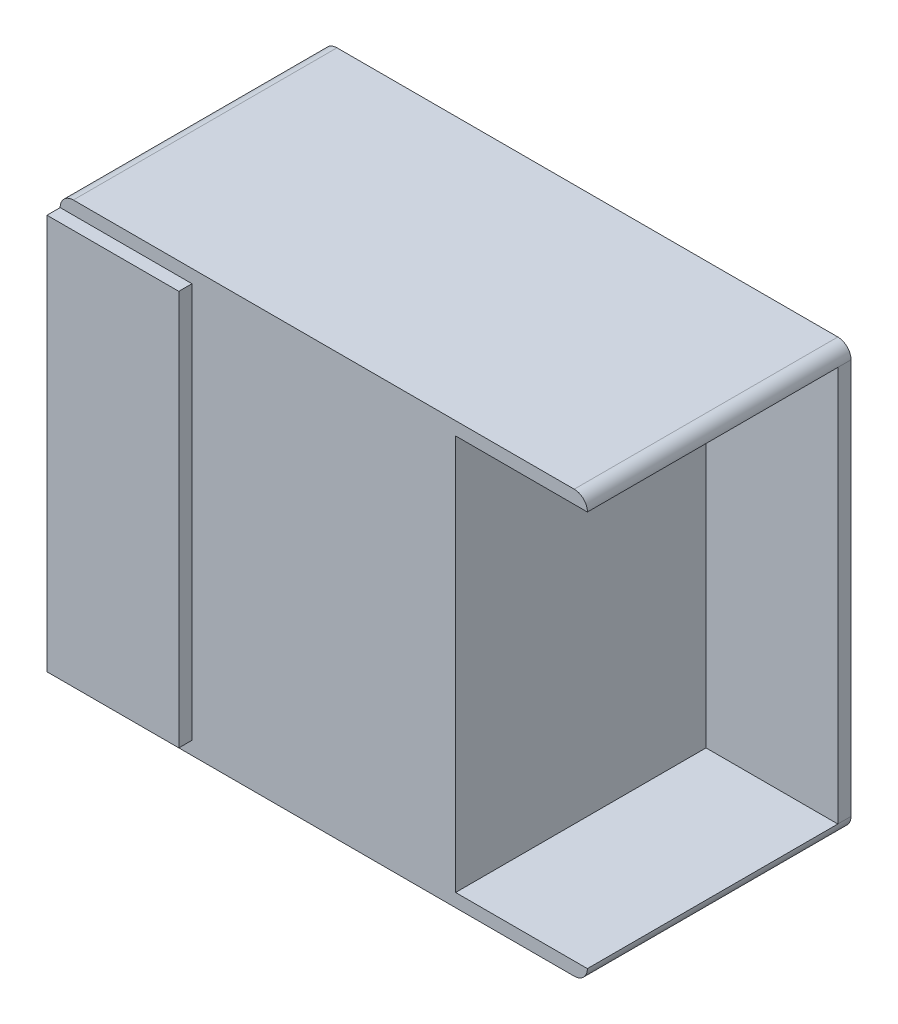
ISO-10303-21;
HEADER;
FILE_DESCRIPTION(('STEP AP214'),'2;1');
FILE_NAME('part.step','',(''),(''),'','','');
FILE_SCHEMA(('AUTOMOTIVE_DESIGN { 1 0 10303 214 1 1 1 1 }'));
ENDSEC;
DATA;
#1=APPLICATION_CONTEXT('core data for automotive mechanical design processes');
#2=APPLICATION_PROTOCOL_DEFINITION('international standard','automotive_design',2000,#1);
#3=PRODUCT_CONTEXT('',#1,'mechanical');
#4=PRODUCT('Part','Part','',(#3));
#5=PRODUCT_RELATED_PRODUCT_CATEGORY('part','',(#4));
#6=PRODUCT_DEFINITION_FORMATION('','',#4);
#7=PRODUCT_DEFINITION_CONTEXT('part definition',#1,'design');
#8=PRODUCT_DEFINITION('design','',#6,#7);
#9=PRODUCT_DEFINITION_SHAPE('','',#8);
#10=(LENGTH_UNIT() NAMED_UNIT(*) SI_UNIT(.MILLI.,.METRE.));
#11=(NAMED_UNIT(*) PLANE_ANGLE_UNIT() SI_UNIT($,.RADIAN.));
#12=(NAMED_UNIT(*) SI_UNIT($,.STERADIAN.) SOLID_ANGLE_UNIT());
#13=UNCERTAINTY_MEASURE_WITH_UNIT(LENGTH_MEASURE(1.E-05),#10,'distance_accuracy_value','');
#14=(GEOMETRIC_REPRESENTATION_CONTEXT(3) GLOBAL_UNCERTAINTY_ASSIGNED_CONTEXT((#13)) GLOBAL_UNIT_ASSIGNED_CONTEXT((#10,
#11,#12)) REPRESENTATION_CONTEXT('',''));
#15=CARTESIAN_POINT('',(0.,0.,0.));
#16=DIRECTION('',(0.,0.,1.));
#17=DIRECTION('',(1.,0.,0.));
#18=AXIS2_PLACEMENT_3D('',#15,#16,#17);
#19=CARTESIAN_POINT('',(15.79883231529,32.75,-0.527911551087));
#20=DIRECTION('',(-1.,0.,0.));
#21=DIRECTION('',(0.,1.,0.));
#22=AXIS2_PLACEMENT_3D('',#19,#20,#21);
#23=PLANE('',#22);
#24=DIRECTION('',(0.,0.,1.));
#25=VECTOR('',#24,1.);
#26=CARTESIAN_POINT('',(15.79883231529,33.5,-0.527911551087));
#27=LINE('',#26,#25);
#28=CARTESIAN_POINT('',(15.79883231529,33.5,-0.05291155108678));
#29=VERTEX_POINT('',#28);
#30=CARTESIAN_POINT('',(15.79883231529,33.5,-0.00291155108678));
#31=VERTEX_POINT('',#30);
#32=EDGE_CURVE('E103',#29,#31,#27,.T.);
#33=ORIENTED_EDGE('',*,*,#32,.T.);
#34=DIRECTION('',(0.,-1.,0.));
#35=VECTOR('',#34,1.);
#36=CARTESIAN_POINT('',(15.79883231529,32.75,-0.00291155108678));
#37=LINE('',#36,#35);
#38=CARTESIAN_POINT('',(15.79883231529,32.,-0.00291155108678));
#39=VERTEX_POINT('',#38);
#40=EDGE_CURVE('E266',#31,#39,#37,.T.);
#41=ORIENTED_EDGE('',*,*,#40,.T.);
#42=DIRECTION('',(0.,0.,-1.));
#43=VECTOR('',#42,1.);
#44=CARTESIAN_POINT('',(15.79883231529,32.,-0.527911551087));
#45=LINE('',#44,#43);
#46=CARTESIAN_POINT('',(15.79883231529,32.,-0.05291155108678));
#47=VERTEX_POINT('',#46);
#48=EDGE_CURVE('E92',#39,#47,#45,.T.);
#49=ORIENTED_EDGE('',*,*,#48,.T.);
#50=DIRECTION('',(0.,1.,0.));
#51=VECTOR('',#50,1.);
#52=CARTESIAN_POINT('',(15.79883231529,32.75,-0.05291155108678));
#53=LINE('',#52,#51);
#54=EDGE_CURVE('E253',#47,#29,#53,.T.);
#55=ORIENTED_EDGE('',*,*,#54,.T.);
#56=EDGE_LOOP('',(#33,#41,#49,#55));
#57=FACE_BOUND('',#56,.T.);
#58=ADVANCED_FACE('F17',(#57),#23,.F.);
#59=CARTESIAN_POINT('',(16.79883231529,32.75,-0.527911551087));
#60=DIRECTION('',(1.,0.,0.));
#61=DIRECTION('',(0.,1.,0.));
#62=AXIS2_PLACEMENT_3D('',#59,#60,#61);
#63=PLANE('',#62);
#64=DIRECTION('',(0.,-1.,0.));
#65=VECTOR('',#64,1.);
#66=CARTESIAN_POINT('',(16.79883231529,32.75,-0.05291155108678));
#67=LINE('',#66,#65);
#68=CARTESIAN_POINT('',(16.79883231529,33.5,-0.05291155108678));
#69=VERTEX_POINT('',#68);
#70=CARTESIAN_POINT('',(16.79883231529,32.,-0.05291155108678));
#71=VERTEX_POINT('',#70);
#72=EDGE_CURVE('E261',#69,#71,#67,.T.);
#73=ORIENTED_EDGE('',*,*,#72,.T.);
#74=DIRECTION('',(0.,0.,1.));
#75=VECTOR('',#74,1.);
#76=CARTESIAN_POINT('',(16.79883231529,32.,-0.527911551087));
#77=LINE('',#76,#75);
#78=CARTESIAN_POINT('',(16.79883231529,32.,-1.002911551087));
#79=VERTEX_POINT('',#78);
#80=EDGE_CURVE('E28',#79,#71,#77,.T.);
#81=ORIENTED_EDGE('',*,*,#80,.F.);
#82=DIRECTION('',(0.,1.,0.));
#83=VECTOR('',#82,1.);
#84=CARTESIAN_POINT('',(16.79883231529,32.75,-1.002911551087));
#85=LINE('',#84,#83);
#86=CARTESIAN_POINT('',(16.79883231529,33.5,-1.002911551087));
#87=VERTEX_POINT('',#86);
#88=EDGE_CURVE('E11',#79,#87,#85,.T.);
#89=ORIENTED_EDGE('',*,*,#88,.T.);
#90=DIRECTION('',(0.,0.,-1.));
#91=VECTOR('',#90,1.);
#92=CARTESIAN_POINT('',(16.79883231529,33.5,-0.527911551087));
#93=LINE('',#92,#91);
#94=EDGE_CURVE('E238',#69,#87,#93,.T.);
#95=ORIENTED_EDGE('',*,*,#94,.F.);
#96=EDGE_LOOP('',(#73,#81,#89,#95));
#97=FACE_BOUND('',#96,.T.);
#98=ADVANCED_FACE('F412',(#97),#63,.T.);
#99=CARTESIAN_POINT('',(17.02383231529,32.75,-1.002911551087));
#100=DIRECTION('',(0.,0.,-1.));
#101=DIRECTION('',(-1.,0.,0.));
#102=AXIS2_PLACEMENT_3D('',#99,#100,#101);
#103=PLANE('',#102);
#104=DIRECTION('',(-1.,0.,0.));
#105=VECTOR('',#104,1.);
#106=CARTESIAN_POINT('',(17.02383231529,32.,-1.002911551087));
#107=LINE('',#106,#105);
#108=CARTESIAN_POINT('',(17.29883231529,32.,-1.002911551087));
#109=VERTEX_POINT('',#108);
#110=EDGE_CURVE('E302',#109,#79,#107,.T.);
#111=ORIENTED_EDGE('',*,*,#110,.F.);
#112=DIRECTION('',(0.,1.,0.));
#113=VECTOR('',#112,1.);
#114=CARTESIAN_POINT('',(17.29883231529,32.75,-1.002911551087));
#115=LINE('',#114,#113);
#116=CARTESIAN_POINT('',(17.29883231529,33.5,-1.002911551087));
#117=VERTEX_POINT('',#116);
#118=EDGE_CURVE('E223',#109,#117,#115,.T.);
#119=ORIENTED_EDGE('',*,*,#118,.T.);
#120=DIRECTION('',(1.,0.,0.));
#121=VECTOR('',#120,1.);
#122=CARTESIAN_POINT('',(17.02383231529,33.5,-1.002911551087));
#123=LINE('',#122,#121);
#124=EDGE_CURVE('E259',#87,#117,#123,.T.);
#125=ORIENTED_EDGE('',*,*,#124,.F.);
#126=ORIENTED_EDGE('',*,*,#88,.F.);
#127=EDGE_LOOP('',(#111,#119,#125,#126));
#128=FACE_BOUND('',#127,.T.);
#129=ADVANCED_FACE('F410',(#128),#103,.F.);
#130=CARTESIAN_POINT('',(17.02383231529,32.,-0.527911551087));
#131=DIRECTION('',(0.,1.,0.));
#132=DIRECTION('',(1.,0.,0.));
#133=AXIS2_PLACEMENT_3D('',#130,#131,#132);
#134=PLANE('',#133);
#135=DIRECTION('',(1.,0.,0.));
#136=VECTOR('',#135,1.);
#137=CARTESIAN_POINT('',(16.29883231529,32.,-0.05291155108678));
#138=LINE('',#137,#136);
#139=CARTESIAN_POINT('',(17.29883231529,32.,-0.05291155108678));
#140=VERTEX_POINT('',#139);
#141=EDGE_CURVE('E232',#71,#140,#138,.T.);
#142=ORIENTED_EDGE('',*,*,#141,.T.);
#143=DIRECTION('',(0.,0.,1.));
#144=VECTOR('',#143,1.);
#145=CARTESIAN_POINT('',(17.29883231529,32.,-0.552911551087));
#146=LINE('',#145,#144);
#147=EDGE_CURVE('E224',#109,#140,#146,.T.);
#148=ORIENTED_EDGE('',*,*,#147,.F.);
#149=ORIENTED_EDGE('',*,*,#110,.T.);
#150=ORIENTED_EDGE('',*,*,#80,.T.);
#151=EDGE_LOOP('',(#142,#148,#149,#150));
#152=FACE_BOUND('',#151,.T.);
#153=ADVANCED_FACE('F395',(#152),#134,.T.);
#154=CARTESIAN_POINT('',(15.57383231529,33.5,-0.527911551087));
#155=DIRECTION('',(0.,-1.,0.));
#156=DIRECTION('',(0.,0.,-1.));
#157=AXIS2_PLACEMENT_3D('',#154,#155,#156);
#158=PLANE('',#157);
#159=DIRECTION('',(0.,0.,1.));
#160=VECTOR('',#159,1.);
#161=CARTESIAN_POINT('',(15.29883231529,33.5,-0.527911551087));
#162=LINE('',#161,#160);
#163=CARTESIAN_POINT('',(15.29883231529,33.5,-0.05291155108678));
#164=VERTEX_POINT('',#163);
#165=CARTESIAN_POINT('',(15.29883231529,33.5,-0.00291155108678));
#166=VERTEX_POINT('',#165);
#167=EDGE_CURVE('E294',#164,#166,#162,.T.);
#168=ORIENTED_EDGE('',*,*,#167,.T.);
#169=DIRECTION('',(1.,0.,0.));
#170=VECTOR('',#169,1.);
#171=CARTESIAN_POINT('',(15.57383231529,33.5,-0.00291155108678));
#172=LINE('',#171,#170);
#173=EDGE_CURVE('E303',#166,#31,#172,.T.);
#174=ORIENTED_EDGE('',*,*,#173,.T.);
#175=ORIENTED_EDGE('',*,*,#32,.F.);
#176=DIRECTION('',(-1.,0.,0.));
#177=VECTOR('',#176,1.);
#178=CARTESIAN_POINT('',(16.29883231529,33.5,-0.05291155108678));
#179=LINE('',#178,#177);
#180=EDGE_CURVE('E127',#29,#164,#179,.T.);
#181=ORIENTED_EDGE('',*,*,#180,.T.);
#182=EDGE_LOOP('',(#168,#174,#175,#181));
#183=FACE_BOUND('',#182,.T.);
#184=ADVANCED_FACE('F314',(#183),#158,.F.);
#185=CARTESIAN_POINT('',(15.57383231529,32.75,-0.00291155108678));
#186=DIRECTION('',(0.,0.,-1.));
#187=DIRECTION('',(-1.,0.,0.));
#188=AXIS2_PLACEMENT_3D('',#185,#186,#187);
#189=PLANE('',#188);
#190=DIRECTION('',(0.,-1.,0.));
#191=VECTOR('',#190,1.);
#192=CARTESIAN_POINT('',(15.29883231529,32.75,-0.00291155108678));
#193=LINE('',#192,#191);
#194=CARTESIAN_POINT('',(15.29883231529,32.,-0.00291155108678));
#195=VERTEX_POINT('',#194);
#196=EDGE_CURVE('E291',#166,#195,#193,.T.);
#197=ORIENTED_EDGE('',*,*,#196,.T.);
#198=DIRECTION('',(1.,0.,0.));
#199=VECTOR('',#198,1.);
#200=CARTESIAN_POINT('',(15.57383231529,32.,-0.00291155108678));
#201=LINE('',#200,#199);
#202=EDGE_CURVE('E247',#195,#39,#201,.T.);
#203=ORIENTED_EDGE('',*,*,#202,.T.);
#204=ORIENTED_EDGE('',*,*,#40,.F.);
#205=ORIENTED_EDGE('',*,*,#173,.F.);
#206=EDGE_LOOP('',(#197,#203,#204,#205));
#207=FACE_BOUND('',#206,.T.);
#208=ADVANCED_FACE('F317',(#207),#189,.F.);
#209=CARTESIAN_POINT('',(15.57383231529,32.,-0.527911551087));
#210=DIRECTION('',(0.,1.,0.));
#211=DIRECTION('',(1.,0.,0.));
#212=AXIS2_PLACEMENT_3D('',#209,#210,#211);
#213=PLANE('',#212);
#214=ORIENTED_EDGE('',*,*,#48,.F.);
#215=ORIENTED_EDGE('',*,*,#202,.F.);
#216=DIRECTION('',(0.,0.,-1.));
#217=VECTOR('',#216,1.);
#218=CARTESIAN_POINT('',(15.29883231529,32.,-0.527911551087));
#219=LINE('',#218,#217);
#220=CARTESIAN_POINT('',(15.29883231529,32.,-0.05291155108678));
#221=VERTEX_POINT('',#220);
#222=EDGE_CURVE('E176',#195,#221,#219,.T.);
#223=ORIENTED_EDGE('',*,*,#222,.T.);
#224=DIRECTION('',(1.,0.,0.));
#225=VECTOR('',#224,1.);
#226=CARTESIAN_POINT('',(16.29883231529,32.,-0.05291155108678));
#227=LINE('',#226,#225);
#228=EDGE_CURVE('E21',#221,#47,#227,.T.);
#229=ORIENTED_EDGE('',*,*,#228,.T.);
#230=EDGE_LOOP('',(#214,#215,#223,#229));
#231=FACE_BOUND('',#230,.T.);
#232=ADVANCED_FACE('F432',(#231),#213,.F.);
#233=CARTESIAN_POINT('',(16.29883231529,32.75,-0.05291155108678));
#234=DIRECTION('',(0.,0.,-1.));
#235=DIRECTION('',(-1.,0.,0.));
#236=AXIS2_PLACEMENT_3D('',#233,#234,#235);
#237=PLANE('',#236);
#238=ORIENTED_EDGE('',*,*,#72,.F.);
#239=DIRECTION('',(-1.,0.,0.));
#240=VECTOR('',#239,1.);
#241=CARTESIAN_POINT('',(17.02383231529,33.5,-0.05291155108678));
#242=LINE('',#241,#240);
#243=CARTESIAN_POINT('',(17.29883231529,33.5,-0.05291155108678));
#244=VERTEX_POINT('',#243);
#245=EDGE_CURVE('E231',#244,#69,#242,.T.);
#246=ORIENTED_EDGE('',*,*,#245,.F.);
#247=CARTESIAN_POINT('',(17.24883231529,33.5,-0.05291155108678));
#248=DIRECTION('',(0.,0.,-1.));
#249=DIRECTION('',(-1.,0.,0.));
#250=AXIS2_PLACEMENT_3D('',#247,#248,#249);
#251=CIRCLE('',#250,0.05);
#252=CARTESIAN_POINT('',(17.24883231529,33.55,-0.05291155108678));
#253=VERTEX_POINT('',#252);
#254=EDGE_CURVE('E227',#253,#244,#251,.T.);
#255=ORIENTED_EDGE('',*,*,#254,.F.);
#256=DIRECTION('',(-1.,0.,0.));
#257=VECTOR('',#256,1.);
#258=CARTESIAN_POINT('',(16.29883231529,33.55,-0.05291155108678));
#259=LINE('',#258,#257);
#260=CARTESIAN_POINT('',(15.34883231529,33.55,-0.05291155108678));
#261=VERTEX_POINT('',#260);
#262=EDGE_CURVE('E273',#253,#261,#259,.T.);
#263=ORIENTED_EDGE('',*,*,#262,.T.);
#264=CARTESIAN_POINT('',(15.34883231529,33.5,-0.05291155108678));
#265=DIRECTION('',(0.,0.,-1.));
#266=DIRECTION('',(-1.,0.,0.));
#267=AXIS2_PLACEMENT_3D('',#264,#265,#266);
#268=CIRCLE('',#267,0.05);
#269=EDGE_CURVE('E142',#164,#261,#268,.T.);
#270=ORIENTED_EDGE('',*,*,#269,.F.);
#271=ORIENTED_EDGE('',*,*,#180,.F.);
#272=ORIENTED_EDGE('',*,*,#54,.F.);
#273=ORIENTED_EDGE('',*,*,#228,.F.);
#274=CARTESIAN_POINT('',(15.34883231529,32.,-0.05291155108678));
#275=DIRECTION('',(0.,0.,-1.));
#276=DIRECTION('',(-1.,0.,0.));
#277=AXIS2_PLACEMENT_3D('',#274,#275,#276);
#278=CIRCLE('',#277,0.05);
#279=CARTESIAN_POINT('',(15.34883231529,31.95,-0.05291155108678));
#280=VERTEX_POINT('',#279);
#281=EDGE_CURVE('E171',#280,#221,#278,.T.);
#282=ORIENTED_EDGE('',*,*,#281,.F.);
#283=DIRECTION('',(1.,0.,0.));
#284=VECTOR('',#283,1.);
#285=CARTESIAN_POINT('',(16.29883231529,31.95,-0.05291155108678));
#286=LINE('',#285,#284);
#287=CARTESIAN_POINT('',(17.24883231529,31.95,-0.05291155108678));
#288=VERTEX_POINT('',#287);
#289=EDGE_CURVE('E213',#280,#288,#286,.T.);
#290=ORIENTED_EDGE('',*,*,#289,.T.);
#291=CARTESIAN_POINT('',(17.24883231529,32.,-0.05291155108678));
#292=DIRECTION('',(0.,0.,-1.));
#293=DIRECTION('',(-1.,0.,0.));
#294=AXIS2_PLACEMENT_3D('',#291,#292,#293);
#295=CIRCLE('',#294,0.05);
#296=EDGE_CURVE('E219',#140,#288,#295,.T.);
#297=ORIENTED_EDGE('',*,*,#296,.F.);
#298=ORIENTED_EDGE('',*,*,#141,.F.);
#299=EDGE_LOOP('',(#238,#246,#255,#263,#270,#271,#272,#273,#282,#290,#297,#298));
#300=FACE_BOUND('',#299,.T.);
#301=ADVANCED_FACE('F321',(#300),#237,.F.);
#302=CARTESIAN_POINT('',(17.02383231529,33.5,-0.527911551087));
#303=DIRECTION('',(0.,-1.,0.));
#304=DIRECTION('',(0.,0.,-1.));
#305=AXIS2_PLACEMENT_3D('',#302,#303,#304);
#306=PLANE('',#305);
#307=ORIENTED_EDGE('',*,*,#245,.T.);
#308=ORIENTED_EDGE('',*,*,#94,.T.);
#309=ORIENTED_EDGE('',*,*,#124,.T.);
#310=DIRECTION('',(0.,0.,-1.));
#311=VECTOR('',#310,1.);
#312=CARTESIAN_POINT('',(17.29883231529,33.5,-0.552911551087));
#313=LINE('',#312,#311);
#314=EDGE_CURVE('E251',#244,#117,#313,.T.);
#315=ORIENTED_EDGE('',*,*,#314,.F.);
#316=EDGE_LOOP('',(#307,#308,#309,#315));
#317=FACE_BOUND('',#316,.T.);
#318=ADVANCED_FACE('F409',(#317),#306,.T.);
#319=CARTESIAN_POINT('',(17.29883231529,32.75,-0.552911551087));
#320=DIRECTION('',(-1.,0.,0.));
#321=DIRECTION('',(0.,1.,0.));
#322=AXIS2_PLACEMENT_3D('',#319,#320,#321);
#323=PLANE('',#322);
#324=DIRECTION('',(0.,0.,-1.));
#325=VECTOR('',#324,1.);
#326=CARTESIAN_POINT('',(17.29883231529,33.5,-0.552911551087));
#327=LINE('',#326,#325);
#328=CARTESIAN_POINT('',(17.29883231529,33.5,-1.052911551087));
#329=VERTEX_POINT('',#328);
#330=EDGE_CURVE('E248',#117,#329,#327,.T.);
#331=ORIENTED_EDGE('',*,*,#330,.F.);
#332=ORIENTED_EDGE('',*,*,#118,.F.);
#333=DIRECTION('',(0.,0.,1.));
#334=VECTOR('',#333,1.);
#335=CARTESIAN_POINT('',(17.29883231529,32.,-0.552911551087));
#336=LINE('',#335,#334);
#337=CARTESIAN_POINT('',(17.29883231529,32.,-1.052911551087));
#338=VERTEX_POINT('',#337);
#339=EDGE_CURVE('E217',#338,#109,#336,.T.);
#340=ORIENTED_EDGE('',*,*,#339,.F.);
#341=DIRECTION('',(0.,-1.,0.));
#342=VECTOR('',#341,1.);
#343=CARTESIAN_POINT('',(17.29883231529,32.75,-1.052911551087));
#344=LINE('',#343,#342);
#345=EDGE_CURVE('E205',#329,#338,#344,.T.);
#346=ORIENTED_EDGE('',*,*,#345,.F.);
#347=EDGE_LOOP('',(#331,#332,#340,#346));
#348=FACE_BOUND('',#347,.T.);
#349=ADVANCED_FACE('F352',(#348),#323,.F.);
#350=CARTESIAN_POINT('',(17.24883231529,32.,-0.552911551087));
#351=DIRECTION('',(0.,0.,-1.));
#352=DIRECTION('',(-1.,0.,0.));
#353=AXIS2_PLACEMENT_3D('',#350,#351,#352);
#354=CYLINDRICAL_SURFACE('',#353,0.05);
#355=CARTESIAN_POINT('',(17.24883231529,32.,-1.052911551087));
#356=DIRECTION('',(0.,0.,-1.));
#357=DIRECTION('',(-1.,0.,0.));
#358=AXIS2_PLACEMENT_3D('',#355,#356,#357);
#359=CIRCLE('',#358,0.05);
#360=CARTESIAN_POINT('',(17.24883231529,31.95,-1.052911551087));
#361=VERTEX_POINT('',#360);
#362=EDGE_CURVE('E199',#338,#361,#359,.T.);
#363=ORIENTED_EDGE('',*,*,#362,.F.);
#364=ORIENTED_EDGE('',*,*,#339,.T.);
#365=ORIENTED_EDGE('',*,*,#147,.T.);
#366=ORIENTED_EDGE('',*,*,#296,.T.);
#367=DIRECTION('',(0.,0.,-1.));
#368=VECTOR('',#367,1.);
#369=CARTESIAN_POINT('',(17.24883231529,31.95,-0.552911551087));
#370=LINE('',#369,#368);
#371=EDGE_CURVE('E218',#288,#361,#370,.T.);
#372=ORIENTED_EDGE('',*,*,#371,.T.);
#373=EDGE_LOOP('',(#363,#364,#365,#366,#372));
#374=FACE_BOUND('',#373,.T.);
#375=ADVANCED_FACE('F346',(#374),#354,.T.);
#376=CARTESIAN_POINT('',(16.29883231529,31.95,-0.552911551087));
#377=DIRECTION('',(0.,1.,0.));
#378=DIRECTION('',(1.,0.,0.));
#379=AXIS2_PLACEMENT_3D('',#376,#377,#378);
#380=PLANE('',#379);
#381=DIRECTION('',(0.,0.,1.));
#382=VECTOR('',#381,1.);
#383=CARTESIAN_POINT('',(15.34883231529,31.95,-0.552911551087));
#384=LINE('',#383,#382);
#385=CARTESIAN_POINT('',(15.34883231529,31.95,-1.052911551087));
#386=VERTEX_POINT('',#385);
#387=EDGE_CURVE('E269',#386,#280,#384,.T.);
#388=ORIENTED_EDGE('',*,*,#387,.F.);
#389=DIRECTION('',(-1.,0.,0.));
#390=VECTOR('',#389,1.);
#391=CARTESIAN_POINT('',(16.29883231529,31.95,-1.052911551087));
#392=LINE('',#391,#390);
#393=EDGE_CURVE('E192',#361,#386,#392,.T.);
#394=ORIENTED_EDGE('',*,*,#393,.F.);
#395=ORIENTED_EDGE('',*,*,#371,.F.);
#396=ORIENTED_EDGE('',*,*,#289,.F.);
#397=EDGE_LOOP('',(#388,#394,#395,#396));
#398=FACE_BOUND('',#397,.T.);
#399=ADVANCED_FACE('F19',(#398),#380,.F.);
#400=CARTESIAN_POINT('',(15.34883231529,32.,-0.552911551087));
#401=DIRECTION('',(0.,0.,-1.));
#402=DIRECTION('',(-1.,0.,0.));
#403=AXIS2_PLACEMENT_3D('',#400,#401,#402);
#404=CYLINDRICAL_SURFACE('',#403,0.05);
#405=ORIENTED_EDGE('',*,*,#387,.T.);
#406=ORIENTED_EDGE('',*,*,#281,.T.);
#407=DIRECTION('',(0.,0.,-1.));
#408=VECTOR('',#407,1.);
#409=CARTESIAN_POINT('',(15.29883231529,32.,-0.527911551087));
#410=LINE('',#409,#408);
#411=CARTESIAN_POINT('',(15.29883231529,32.,-1.052911551087));
#412=VERTEX_POINT('',#411);
#413=EDGE_CURVE('E163',#221,#412,#410,.T.);
#414=ORIENTED_EDGE('',*,*,#413,.T.);
#415=CARTESIAN_POINT('',(15.34883231529,32.,-1.052911551087));
#416=DIRECTION('',(0.,0.,-1.));
#417=DIRECTION('',(-1.,0.,0.));
#418=AXIS2_PLACEMENT_3D('',#415,#416,#417);
#419=CIRCLE('',#418,0.05);
#420=EDGE_CURVE('E168',#386,#412,#419,.T.);
#421=ORIENTED_EDGE('',*,*,#420,.F.);
#422=EDGE_LOOP('',(#405,#406,#414,#421));
#423=FACE_BOUND('',#422,.T.);
#424=ADVANCED_FACE('F166',(#423),#404,.T.);
#425=CARTESIAN_POINT('',(15.29883231529,32.75,-0.527911551087));
#426=DIRECTION('',(1.,0.,0.));
#427=DIRECTION('',(0.,1.,0.));
#428=AXIS2_PLACEMENT_3D('',#425,#426,#427);
#429=PLANE('',#428);
#430=DIRECTION('',(0.,1.,0.));
#431=VECTOR('',#430,1.);
#432=CARTESIAN_POINT('',(15.29883231529,32.75,-1.052911551087));
#433=LINE('',#432,#431);
#434=CARTESIAN_POINT('',(15.29883231529,33.5,-1.052911551087));
#435=VERTEX_POINT('',#434);
#436=EDGE_CURVE('E179',#412,#435,#433,.T.);
#437=ORIENTED_EDGE('',*,*,#436,.F.);
#438=ORIENTED_EDGE('',*,*,#413,.F.);
#439=ORIENTED_EDGE('',*,*,#222,.F.);
#440=ORIENTED_EDGE('',*,*,#196,.F.);
#441=ORIENTED_EDGE('',*,*,#167,.F.);
#442=DIRECTION('',(0.,0.,1.));
#443=VECTOR('',#442,1.);
#444=CARTESIAN_POINT('',(15.29883231529,33.5,-0.552911551087));
#445=LINE('',#444,#443);
#446=EDGE_CURVE('E181',#435,#164,#445,.T.);
#447=ORIENTED_EDGE('',*,*,#446,.F.);
#448=EDGE_LOOP('',(#437,#438,#439,#440,#441,#447));
#449=FACE_BOUND('',#448,.T.);
#450=ADVANCED_FACE('F180',(#449),#429,.F.);
#451=CARTESIAN_POINT('',(15.34883231529,33.5,-0.552911551087));
#452=DIRECTION('',(0.,0.,-1.));
#453=DIRECTION('',(-1.,0.,0.));
#454=AXIS2_PLACEMENT_3D('',#451,#452,#453);
#455=CYLINDRICAL_SURFACE('',#454,0.05);
#456=ORIENTED_EDGE('',*,*,#446,.T.);
#457=ORIENTED_EDGE('',*,*,#269,.T.);
#458=DIRECTION('',(0.,0.,-1.));
#459=VECTOR('',#458,1.);
#460=CARTESIAN_POINT('',(15.34883231529,33.55,-0.552911551087));
#461=LINE('',#460,#459);
#462=CARTESIAN_POINT('',(15.34883231529,33.55,-1.052911551087));
#463=VERTEX_POINT('',#462);
#464=EDGE_CURVE('E275',#261,#463,#461,.T.);
#465=ORIENTED_EDGE('',*,*,#464,.T.);
#466=CARTESIAN_POINT('',(15.34883231529,33.5,-1.052911551087));
#467=DIRECTION('',(0.,0.,-1.));
#468=DIRECTION('',(-1.,0.,0.));
#469=AXIS2_PLACEMENT_3D('',#466,#467,#468);
#470=CIRCLE('',#469,0.05);
#471=EDGE_CURVE('E186',#435,#463,#470,.T.);
#472=ORIENTED_EDGE('',*,*,#471,.F.);
#473=EDGE_LOOP('',(#456,#457,#465,#472));
#474=FACE_BOUND('',#473,.T.);
#475=ADVANCED_FACE('F327',(#474),#455,.T.);
#476=CARTESIAN_POINT('',(16.29883231529,33.55,-0.552911551087));
#477=DIRECTION('',(0.,-1.,0.));
#478=DIRECTION('',(0.,0.,-1.));
#479=AXIS2_PLACEMENT_3D('',#476,#477,#478);
#480=PLANE('',#479);
#481=DIRECTION('',(0.,0.,1.));
#482=VECTOR('',#481,1.);
#483=CARTESIAN_POINT('',(17.24883231529,33.55,-0.552911551087));
#484=LINE('',#483,#482);
#485=CARTESIAN_POINT('',(17.24883231529,33.55,-1.052911551087));
#486=VERTEX_POINT('',#485);
#487=EDGE_CURVE('E250',#486,#253,#484,.T.);
#488=ORIENTED_EDGE('',*,*,#487,.F.);
#489=DIRECTION('',(1.,0.,0.));
#490=VECTOR('',#489,1.);
#491=CARTESIAN_POINT('',(16.29883231529,33.55,-1.052911551087));
#492=LINE('',#491,#490);
#493=EDGE_CURVE('E206',#463,#486,#492,.T.);
#494=ORIENTED_EDGE('',*,*,#493,.F.);
#495=ORIENTED_EDGE('',*,*,#464,.F.);
#496=ORIENTED_EDGE('',*,*,#262,.F.);
#497=EDGE_LOOP('',(#488,#494,#495,#496));
#498=FACE_BOUND('',#497,.T.);
#499=ADVANCED_FACE('F435',(#498),#480,.F.);
#500=CARTESIAN_POINT('',(17.24883231529,33.5,-0.552911551087));
#501=DIRECTION('',(0.,0.,-1.));
#502=DIRECTION('',(-1.,0.,0.));
#503=AXIS2_PLACEMENT_3D('',#500,#501,#502);
#504=CYLINDRICAL_SURFACE('',#503,0.05);
#505=ORIENTED_EDGE('',*,*,#254,.T.);
#506=ORIENTED_EDGE('',*,*,#314,.T.);
#507=ORIENTED_EDGE('',*,*,#330,.T.);
#508=CARTESIAN_POINT('',(17.24883231529,33.5,-1.052911551087));
#509=DIRECTION('',(0.,0.,-1.));
#510=DIRECTION('',(-1.,0.,0.));
#511=AXIS2_PLACEMENT_3D('',#508,#509,#510);
#512=CIRCLE('',#511,0.05);
#513=EDGE_CURVE('E209',#486,#329,#512,.T.);
#514=ORIENTED_EDGE('',*,*,#513,.F.);
#515=ORIENTED_EDGE('',*,*,#487,.T.);
#516=EDGE_LOOP('',(#505,#506,#507,#514,#515));
#517=FACE_BOUND('',#516,.T.);
#518=ADVANCED_FACE('F406',(#517),#504,.T.);
#519=CARTESIAN_POINT('',(16.29883231529,32.75,-1.052911551087));
#520=DIRECTION('',(0.,0.,-1.));
#521=DIRECTION('',(-1.,0.,0.));
#522=AXIS2_PLACEMENT_3D('',#519,#520,#521);
#523=PLANE('',#522);
#524=ORIENTED_EDGE('',*,*,#493,.T.);
#525=ORIENTED_EDGE('',*,*,#513,.T.);
#526=ORIENTED_EDGE('',*,*,#345,.T.);
#527=ORIENTED_EDGE('',*,*,#362,.T.);
#528=ORIENTED_EDGE('',*,*,#393,.T.);
#529=ORIENTED_EDGE('',*,*,#420,.T.);
#530=ORIENTED_EDGE('',*,*,#436,.T.);
#531=ORIENTED_EDGE('',*,*,#471,.T.);
#532=EDGE_LOOP('',(#524,#525,#526,#527,#528,#529,#530,#531));
#533=FACE_BOUND('',#532,.T.);
#534=ADVANCED_FACE('F189',(#533),#523,.T.);
#535=CLOSED_SHELL('',(#58,#98,#129,#153,#184,#208,#232,#301,#318,#349,#375,#399,#424,#450,#475,
#499,#518,#534));
#536=MANIFOLD_SOLID_BREP('B1',#535);
#537=ADVANCED_BREP_SHAPE_REPRESENTATION('',(#18,#536),#14);
#538=SHAPE_DEFINITION_REPRESENTATION(#9,#537);
ENDSEC;
END-ISO-10303-21;
